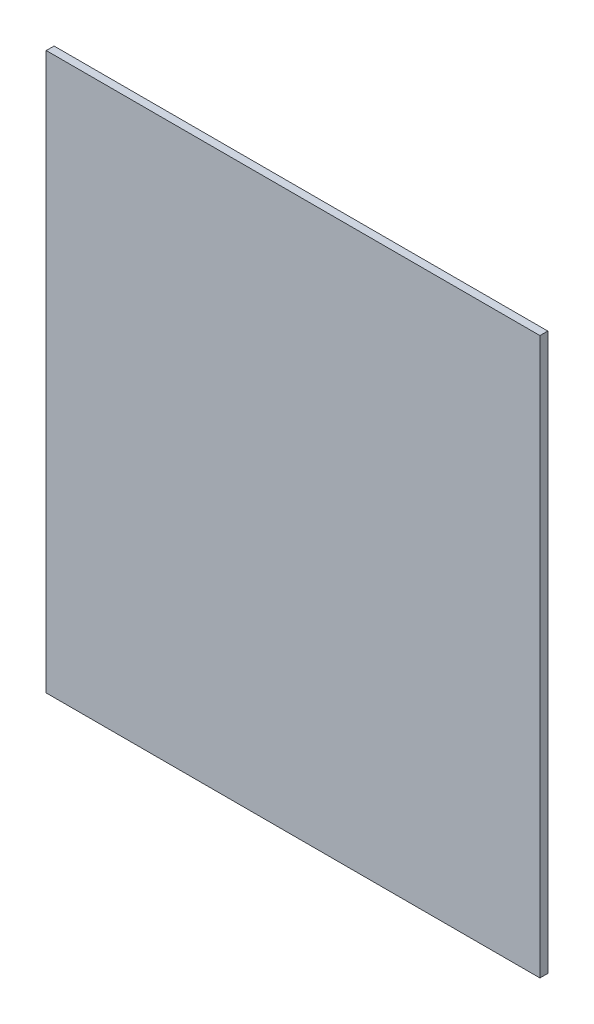
ISO-10303-21;
HEADER;
FILE_DESCRIPTION(('STEP AP214'),'2;1');
FILE_NAME('part.step','',(''),(''),'','','');
FILE_SCHEMA(('AUTOMOTIVE_DESIGN { 1 0 10303 214 1 1 1 1 }'));
ENDSEC;
DATA;
#1=APPLICATION_CONTEXT('core data for automotive mechanical design processes');
#2=APPLICATION_PROTOCOL_DEFINITION('international standard','automotive_design',2000,#1);
#3=PRODUCT_CONTEXT('',#1,'mechanical');
#4=PRODUCT('Part','Part','',(#3));
#5=PRODUCT_RELATED_PRODUCT_CATEGORY('part','',(#4));
#6=PRODUCT_DEFINITION_FORMATION('','',#4);
#7=PRODUCT_DEFINITION_CONTEXT('part definition',#1,'design');
#8=PRODUCT_DEFINITION('design','',#6,#7);
#9=PRODUCT_DEFINITION_SHAPE('','',#8);
#10=(LENGTH_UNIT() NAMED_UNIT(*) SI_UNIT(.MILLI.,.METRE.));
#11=(NAMED_UNIT(*) PLANE_ANGLE_UNIT() SI_UNIT($,.RADIAN.));
#12=(NAMED_UNIT(*) SI_UNIT($,.STERADIAN.) SOLID_ANGLE_UNIT());
#13=UNCERTAINTY_MEASURE_WITH_UNIT(LENGTH_MEASURE(1.E-05),#10,'distance_accuracy_value','');
#14=(GEOMETRIC_REPRESENTATION_CONTEXT(3) GLOBAL_UNCERTAINTY_ASSIGNED_CONTEXT((#13)) GLOBAL_UNIT_ASSIGNED_CONTEXT((#10,
#11,#12)) REPRESENTATION_CONTEXT('',''));
#15=CARTESIAN_POINT('',(0.,0.,0.));
#16=DIRECTION('',(0.,0.,1.));
#17=DIRECTION('',(1.,0.,0.));
#18=AXIS2_PLACEMENT_3D('',#15,#16,#17);
#19=CARTESIAN_POINT('',(-200.025,225.425,6.35));
#20=DIRECTION('',(1.,0.,0.));
#21=DIRECTION('',(0.,1.,0.));
#22=AXIS2_PLACEMENT_3D('',#19,#20,#21);
#23=PLANE('',#22);
#24=DIRECTION('',(0.,-1.,0.));
#25=VECTOR('',#24,1.);
#26=CARTESIAN_POINT('',(-200.025,225.425,0.));
#27=LINE('',#26,#25);
#28=CARTESIAN_POINT('',(-200.025,225.425,0.));
#29=VERTEX_POINT('',#28);
#30=CARTESIAN_POINT('',(-200.025,-225.425,0.));
#31=VERTEX_POINT('',#30);
#32=EDGE_CURVE('E115',#29,#31,#27,.T.);
#33=ORIENTED_EDGE('',*,*,#32,.T.);
#34=DIRECTION('',(0.,0.,-1.));
#35=VECTOR('',#34,1.);
#36=CARTESIAN_POINT('',(-200.025,-225.425,6.35));
#37=LINE('',#36,#35);
#38=CARTESIAN_POINT('',(-200.025,-225.425,6.35));
#39=VERTEX_POINT('',#38);
#40=EDGE_CURVE('E11',#39,#31,#37,.T.);
#41=ORIENTED_EDGE('',*,*,#40,.F.);
#42=DIRECTION('',(0.,-1.,0.));
#43=VECTOR('',#42,1.);
#44=CARTESIAN_POINT('',(-200.025,225.425,6.35));
#45=LINE('',#44,#43);
#46=CARTESIAN_POINT('',(-200.025,225.425,6.35));
#47=VERTEX_POINT('',#46);
#48=EDGE_CURVE('E99',#47,#39,#45,.T.);
#49=ORIENTED_EDGE('',*,*,#48,.F.);
#50=DIRECTION('',(0.,0.,-1.));
#51=VECTOR('',#50,1.);
#52=CARTESIAN_POINT('',(-200.025,225.425,6.35));
#53=LINE('',#52,#51);
#54=EDGE_CURVE('E111',#47,#29,#53,.T.);
#55=ORIENTED_EDGE('',*,*,#54,.T.);
#56=EDGE_LOOP('',(#33,#41,#49,#55));
#57=FACE_BOUND('',#56,.T.);
#58=ADVANCED_FACE('F47',(#57),#23,.F.);
#59=CARTESIAN_POINT('',(-200.025,-225.425,6.35));
#60=DIRECTION('',(0.,1.,0.));
#61=DIRECTION('',(0.,0.,1.));
#62=AXIS2_PLACEMENT_3D('',#59,#60,#61);
#63=PLANE('',#62);
#64=DIRECTION('',(1.,0.,0.));
#65=VECTOR('',#64,1.);
#66=CARTESIAN_POINT('',(-200.025,-225.425,0.));
#67=LINE('',#66,#65);
#68=CARTESIAN_POINT('',(200.025,-225.425,0.));
#69=VERTEX_POINT('',#68);
#70=EDGE_CURVE('E104',#31,#69,#67,.T.);
#71=ORIENTED_EDGE('',*,*,#70,.T.);
#72=DIRECTION('',(0.,0.,-1.));
#73=VECTOR('',#72,1.);
#74=CARTESIAN_POINT('',(200.025,-225.425,6.35));
#75=LINE('',#74,#73);
#76=CARTESIAN_POINT('',(200.025,-225.425,6.35));
#77=VERTEX_POINT('',#76);
#78=EDGE_CURVE('E56',#77,#69,#75,.T.);
#79=ORIENTED_EDGE('',*,*,#78,.F.);
#80=DIRECTION('',(1.,0.,0.));
#81=VECTOR('',#80,1.);
#82=CARTESIAN_POINT('',(-200.025,-225.425,6.35));
#83=LINE('',#82,#81);
#84=EDGE_CURVE('E94',#39,#77,#83,.T.);
#85=ORIENTED_EDGE('',*,*,#84,.F.);
#86=ORIENTED_EDGE('',*,*,#40,.T.);
#87=EDGE_LOOP('',(#71,#79,#85,#86));
#88=FACE_BOUND('',#87,.T.);
#89=ADVANCED_FACE('F103',(#88),#63,.F.);
#90=CARTESIAN_POINT('',(200.025,225.425,6.35));
#91=DIRECTION('',(-1.,0.,0.));
#92=DIRECTION('',(0.,-1.,0.));
#93=AXIS2_PLACEMENT_3D('',#90,#91,#92);
#94=PLANE('',#93);
#95=DIRECTION('',(0.,1.,0.));
#96=VECTOR('',#95,1.);
#97=CARTESIAN_POINT('',(200.025,225.425,0.));
#98=LINE('',#97,#96);
#99=CARTESIAN_POINT('',(200.025,225.425,0.));
#100=VERTEX_POINT('',#99);
#101=EDGE_CURVE('E81',#69,#100,#98,.T.);
#102=ORIENTED_EDGE('',*,*,#101,.T.);
#103=DIRECTION('',(0.,0.,-1.));
#104=VECTOR('',#103,1.);
#105=CARTESIAN_POINT('',(200.025,225.425,6.35));
#106=LINE('',#105,#104);
#107=CARTESIAN_POINT('',(200.025,225.425,6.35));
#108=VERTEX_POINT('',#107);
#109=EDGE_CURVE('E106',#108,#100,#106,.T.);
#110=ORIENTED_EDGE('',*,*,#109,.F.);
#111=DIRECTION('',(0.,1.,0.));
#112=VECTOR('',#111,1.);
#113=CARTESIAN_POINT('',(200.025,225.425,6.35));
#114=LINE('',#113,#112);
#115=EDGE_CURVE('E97',#77,#108,#114,.T.);
#116=ORIENTED_EDGE('',*,*,#115,.F.);
#117=ORIENTED_EDGE('',*,*,#78,.T.);
#118=EDGE_LOOP('',(#102,#110,#116,#117));
#119=FACE_BOUND('',#118,.T.);
#120=ADVANCED_FACE('F107',(#119),#94,.F.);
#121=CARTESIAN_POINT('',(-200.025,225.425,6.35));
#122=DIRECTION('',(0.,-1.,0.));
#123=DIRECTION('',(0.,0.,-1.));
#124=AXIS2_PLACEMENT_3D('',#121,#122,#123);
#125=PLANE('',#124);
#126=DIRECTION('',(-1.,0.,0.));
#127=VECTOR('',#126,1.);
#128=CARTESIAN_POINT('',(-200.025,225.425,0.));
#129=LINE('',#128,#127);
#130=EDGE_CURVE('E87',#100,#29,#129,.T.);
#131=ORIENTED_EDGE('',*,*,#130,.T.);
#132=ORIENTED_EDGE('',*,*,#54,.F.);
#133=DIRECTION('',(-1.,0.,0.));
#134=VECTOR('',#133,1.);
#135=CARTESIAN_POINT('',(-200.025,225.425,6.35));
#136=LINE('',#135,#134);
#137=EDGE_CURVE('E64',#108,#47,#136,.T.);
#138=ORIENTED_EDGE('',*,*,#137,.F.);
#139=ORIENTED_EDGE('',*,*,#109,.T.);
#140=EDGE_LOOP('',(#131,#132,#138,#139));
#141=FACE_BOUND('',#140,.T.);
#142=ADVANCED_FACE('F128',(#141),#125,.F.);
#143=CARTESIAN_POINT('',(0.,0.,6.35));
#144=DIRECTION('',(0.,0.,1.));
#145=DIRECTION('',(1.,0.,0.));
#146=AXIS2_PLACEMENT_3D('',#143,#144,#145);
#147=PLANE('',#146);
#148=ORIENTED_EDGE('',*,*,#48,.T.);
#149=ORIENTED_EDGE('',*,*,#84,.T.);
#150=ORIENTED_EDGE('',*,*,#115,.T.);
#151=ORIENTED_EDGE('',*,*,#137,.T.);
#152=EDGE_LOOP('',(#148,#149,#150,#151));
#153=FACE_BOUND('',#152,.T.);
#154=ADVANCED_FACE('F95',(#153),#147,.T.);
#155=CARTESIAN_POINT('',(0.,0.,0.));
#156=DIRECTION('',(0.,0.,1.));
#157=DIRECTION('',(1.,0.,0.));
#158=AXIS2_PLACEMENT_3D('',#155,#156,#157);
#159=PLANE('',#158);
#160=ORIENTED_EDGE('',*,*,#32,.F.);
#161=ORIENTED_EDGE('',*,*,#130,.F.);
#162=ORIENTED_EDGE('',*,*,#101,.F.);
#163=ORIENTED_EDGE('',*,*,#70,.F.);
#164=EDGE_LOOP('',(#160,#161,#162,#163));
#165=FACE_BOUND('',#164,.T.);
#166=ADVANCED_FACE('F131',(#165),#159,.F.);
#167=CLOSED_SHELL('',(#58,#89,#120,#142,#154,#166));
#168=MANIFOLD_SOLID_BREP('B2',#167);
#169=ADVANCED_BREP_SHAPE_REPRESENTATION('',(#18,#168),#14);
#170=SHAPE_DEFINITION_REPRESENTATION(#9,#169);
ENDSEC;
END-ISO-10303-21;
